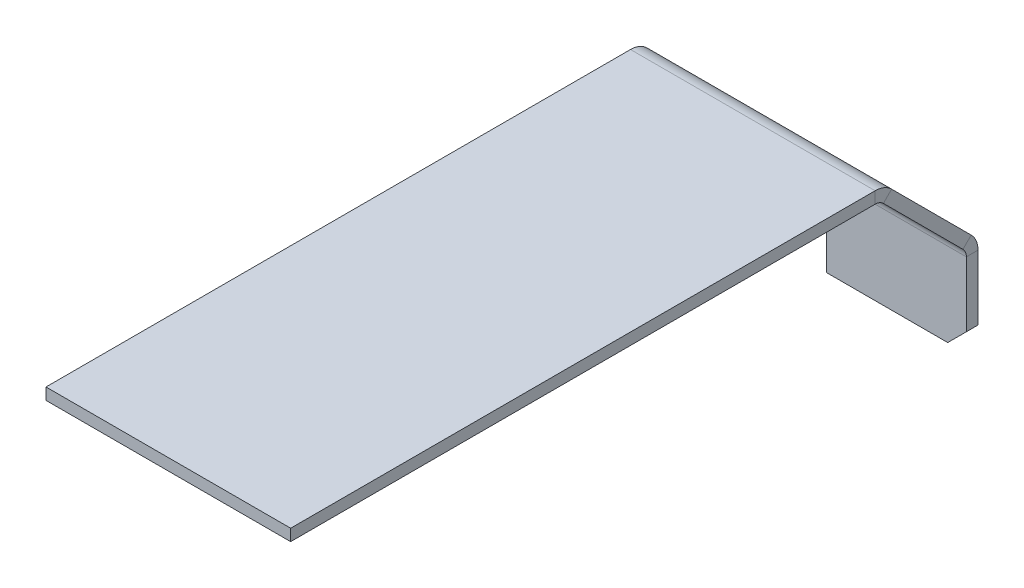
ISO-10303-21;
HEADER;
FILE_DESCRIPTION(('STEP AP214'),'2;1');
FILE_NAME('part.step','',(''),(''),'','','');
FILE_SCHEMA(('AUTOMOTIVE_DESIGN { 1 0 10303 214 1 1 1 1 }'));
ENDSEC;
DATA;
#1=APPLICATION_CONTEXT('core data for automotive mechanical design processes');
#2=APPLICATION_PROTOCOL_DEFINITION('international standard','automotive_design',2000,#1);
#3=PRODUCT_CONTEXT('',#1,'mechanical');
#4=PRODUCT('Part','Part','',(#3));
#5=PRODUCT_RELATED_PRODUCT_CATEGORY('part','',(#4));
#6=PRODUCT_DEFINITION_FORMATION('','',#4);
#7=PRODUCT_DEFINITION_CONTEXT('part definition',#1,'design');
#8=PRODUCT_DEFINITION('design','',#6,#7);
#9=PRODUCT_DEFINITION_SHAPE('','',#8);
#10=(LENGTH_UNIT() NAMED_UNIT(*) SI_UNIT(.MILLI.,.METRE.));
#11=(NAMED_UNIT(*) PLANE_ANGLE_UNIT() SI_UNIT($,.RADIAN.));
#12=(NAMED_UNIT(*) SI_UNIT($,.STERADIAN.) SOLID_ANGLE_UNIT());
#13=UNCERTAINTY_MEASURE_WITH_UNIT(LENGTH_MEASURE(1.E-05),#10,'distance_accuracy_value','');
#14=(GEOMETRIC_REPRESENTATION_CONTEXT(3) GLOBAL_UNCERTAINTY_ASSIGNED_CONTEXT((#13)) GLOBAL_UNIT_ASSIGNED_CONTEXT((#10,
#11,#12)) REPRESENTATION_CONTEXT('',''));
#15=CARTESIAN_POINT('',(0.,0.,0.));
#16=DIRECTION('',(0.,0.,1.));
#17=DIRECTION('',(1.,0.,0.));
#18=AXIS2_PLACEMENT_3D('',#15,#16,#17);
#19=CARTESIAN_POINT('',(52.5,-40.,-35.0000000000001));
#20=DIRECTION('',(0.,0.,-1.));
#21=DIRECTION('',(0.,1.,0.));
#22=AXIS2_PLACEMENT_3D('',#19,#20,#21);
#23=PLANE('',#22);
#24=DIRECTION('',(-1.,0.,0.));
#25=VECTOR('',#24,1.);
#26=CARTESIAN_POINT('',(52.5,-80.,-35.0000000000001));
#27=LINE('',#26,#25);
#28=CARTESIAN_POINT('',(44.5,-80.,-35.0000000000001));
#29=VERTEX_POINT('',#28);
#30=CARTESIAN_POINT('',(-7.50000000000006,-80.,-35.0000000000001));
#31=VERTEX_POINT('',#30);
#32=EDGE_CURVE('E259',#29,#31,#27,.T.);
#33=ORIENTED_EDGE('',*,*,#32,.F.);
#34=DIRECTION('',(-0.707106781186546,-0.707106781186549,0.));
#35=VECTOR('',#34,1.);
#36=CARTESIAN_POINT('',(44.5,-80.,-35.0000000000001));
#37=LINE('',#36,#35);
#38=CARTESIAN_POINT('',(52.5,-72.,-35.0000000000001));
#39=VERTEX_POINT('',#38);
#40=EDGE_CURVE('E60',#29,#39,#37,.F.);
#41=ORIENTED_EDGE('',*,*,#40,.T.);
#42=DIRECTION('',(0.,-1.,0.));
#43=VECTOR('',#42,1.);
#44=CARTESIAN_POINT('',(52.5,-40.,-35.0000000000001));
#45=LINE('',#44,#43);
#46=CARTESIAN_POINT('',(52.5,-44.142135623731,-35.0000000000001));
#47=VERTEX_POINT('',#46);
#48=EDGE_CURVE('E196',#47,#39,#45,.T.);
#49=ORIENTED_EDGE('',*,*,#48,.F.);
#50=DIRECTION('',(-1.,0.,0.));
#51=VECTOR('',#50,1.);
#52=CARTESIAN_POINT('',(52.5,-44.142135623731,-35.0000000000001));
#53=LINE('',#52,#51);
#54=CARTESIAN_POINT('',(-7.49999999999995,-44.1421356237309,-35.0000000000001));
#55=VERTEX_POINT('',#54);
#56=EDGE_CURVE('E182',#47,#55,#53,.T.);
#57=ORIENTED_EDGE('',*,*,#56,.T.);
#58=DIRECTION('',(0.,-1.,0.));
#59=VECTOR('',#58,1.);
#60=CARTESIAN_POINT('',(-7.49999999999995,-40.,-35.0000000000001));
#61=LINE('',#60,#59);
#62=EDGE_CURVE('E175',#55,#31,#61,.T.);
#63=ORIENTED_EDGE('',*,*,#62,.T.);
#64=EDGE_LOOP('',(#33,#41,#49,#57,#63));
#65=FACE_BOUND('',#64,.T.);
#66=ADVANCED_FACE('F38',(#65),#23,.F.);
#67=CARTESIAN_POINT('',(52.5,-80.,-40.));
#68=DIRECTION('',(0.,-1.,0.));
#69=DIRECTION('',(0.,0.,-1.));
#70=AXIS2_PLACEMENT_3D('',#67,#68,#69);
#71=PLANE('',#70);
#72=DIRECTION('',(-1.,0.,0.));
#73=VECTOR('',#72,1.);
#74=CARTESIAN_POINT('',(52.5,-80.,-40.));
#75=LINE('',#74,#73);
#76=CARTESIAN_POINT('',(44.5,-80.,-40.));
#77=VERTEX_POINT('',#76);
#78=CARTESIAN_POINT('',(-7.50000000000006,-80.,-40.));
#79=VERTEX_POINT('',#78);
#80=EDGE_CURVE('E257',#77,#79,#75,.T.);
#81=ORIENTED_EDGE('',*,*,#80,.F.);
#82=DIRECTION('',(0.,0.,1.));
#83=VECTOR('',#82,1.);
#84=CARTESIAN_POINT('',(44.5,-80.,-40.));
#85=LINE('',#84,#83);
#86=EDGE_CURVE('E382',#77,#29,#85,.T.);
#87=ORIENTED_EDGE('',*,*,#86,.T.);
#88=ORIENTED_EDGE('',*,*,#32,.T.);
#89=DIRECTION('',(0.,0.,1.));
#90=VECTOR('',#89,1.);
#91=CARTESIAN_POINT('',(-7.50000000000006,-80.,-35.0000000000001));
#92=LINE('',#91,#90);
#93=EDGE_CURVE('E187',#31,#79,#92,.F.);
#94=ORIENTED_EDGE('',*,*,#93,.T.);
#95=EDGE_LOOP('',(#81,#87,#88,#94));
#96=FACE_BOUND('',#95,.T.);
#97=ADVANCED_FACE('F328',(#96),#71,.T.);
#98=CARTESIAN_POINT('',(52.5,-40.,-40.));
#99=DIRECTION('',(0.,0.,-1.));
#100=DIRECTION('',(0.,1.,0.));
#101=AXIS2_PLACEMENT_3D('',#98,#99,#100);
#102=PLANE('',#101);
#103=DIRECTION('',(0.,-1.,0.));
#104=VECTOR('',#103,1.);
#105=CARTESIAN_POINT('',(52.5,-40.,-40.));
#106=LINE('',#105,#104);
#107=CARTESIAN_POINT('',(52.5,-44.1421356237309,-40.));
#108=VERTEX_POINT('',#107);
#109=CARTESIAN_POINT('',(52.5,-71.9999999999999,-40.));
#110=VERTEX_POINT('',#109);
#111=EDGE_CURVE('E198',#108,#110,#106,.T.);
#112=ORIENTED_EDGE('',*,*,#111,.T.);
#113=DIRECTION('',(0.707106781186546,0.707106781186549,0.));
#114=VECTOR('',#113,1.);
#115=CARTESIAN_POINT('',(68.5,-55.9999999999999,-40.));
#116=LINE('',#115,#114);
#117=EDGE_CURVE('E11',#110,#77,#116,.F.);
#118=ORIENTED_EDGE('',*,*,#117,.T.);
#119=ORIENTED_EDGE('',*,*,#80,.T.);
#120=DIRECTION('',(0.,1.,0.));
#121=VECTOR('',#120,1.);
#122=CARTESIAN_POINT('',(-7.49999999999995,-40.,-40.));
#123=LINE('',#122,#121);
#124=CARTESIAN_POINT('',(-7.49999999999995,-44.1421356237309,-40.));
#125=VERTEX_POINT('',#124);
#126=EDGE_CURVE('E392',#125,#79,#123,.F.);
#127=ORIENTED_EDGE('',*,*,#126,.F.);
#128=DIRECTION('',(-1.,0.,0.));
#129=VECTOR('',#128,1.);
#130=CARTESIAN_POINT('',(52.5,-44.1421356237309,-40.));
#131=LINE('',#130,#129);
#132=EDGE_CURVE('E254',#108,#125,#131,.T.);
#133=ORIENTED_EDGE('',*,*,#132,.F.);
#134=EDGE_LOOP('',(#112,#118,#119,#127,#133));
#135=FACE_BOUND('',#134,.T.);
#136=ADVANCED_FACE('F333',(#135),#102,.T.);
#137=CARTESIAN_POINT('',(52.5,-44.142135623731,-30.0000000000002));
#138=DIRECTION('',(-1.,0.,0.));
#139=DIRECTION('',(0.,0.,1.));
#140=AXIS2_PLACEMENT_3D('',#137,#138,#139);
#141=CYLINDRICAL_SURFACE('',#140,10.);
#142=ORIENTED_EDGE('',*,*,#132,.T.);
#143=CARTESIAN_POINT('',(-7.49999999999995,-44.142135623731,-30.0000000000002));
#144=DIRECTION('',(1.,0.,0.));
#145=DIRECTION('',(0.,1.,0.));
#146=AXIS2_PLACEMENT_3D('',#143,#144,#145);
#147=CIRCLE('',#146,10.);
#148=CARTESIAN_POINT('',(-7.49999999999995,-37.0710678118655,-37.0710678118655));
#149=VERTEX_POINT('',#148);
#150=EDGE_CURVE('E176',#149,#125,#147,.F.);
#151=ORIENTED_EDGE('',*,*,#150,.F.);
#152=DIRECTION('',(-1.,0.,0.));
#153=VECTOR('',#152,1.);
#154=CARTESIAN_POINT('',(52.5,-37.0710678118655,-37.0710678118655));
#155=LINE('',#154,#153);
#156=CARTESIAN_POINT('',(52.5,-37.0710678118655,-37.0710678118655));
#157=VERTEX_POINT('',#156);
#158=EDGE_CURVE('E251',#157,#149,#155,.T.);
#159=ORIENTED_EDGE('',*,*,#158,.F.);
#160=CARTESIAN_POINT('',(52.5,-44.142135623731,-30.0000000000002));
#161=DIRECTION('',(1.,0.,0.));
#162=DIRECTION('',(0.,0.,-1.));
#163=AXIS2_PLACEMENT_3D('',#160,#161,#162);
#164=CIRCLE('',#163,10.);
#165=EDGE_CURVE('E201',#157,#108,#164,.F.);
#166=ORIENTED_EDGE('',*,*,#165,.T.);
#167=EDGE_LOOP('',(#142,#151,#159,#166));
#168=FACE_BOUND('',#167,.T.);
#169=ADVANCED_FACE('F402',(#168),#141,.T.);
#170=CARTESIAN_POINT('',(52.5,0.,0.));
#171=DIRECTION('',(0.,0.707106781186548,-0.707106781186547));
#172=DIRECTION('',(0.,0.707106781186547,0.707106781186548));
#173=AXIS2_PLACEMENT_3D('',#170,#171,#172);
#174=PLANE('',#173);
#175=CARTESIAN_POINT('',(-65.4531328127443,-48.0582056827674,-48.0582056827679));
#176=DIRECTION('',(0.,0.707106781186548,-0.707106781186547));
#177=DIRECTION('',(0.,0.707106781186547,0.707106781186548));
#178=AXIS2_PLACEMENT_3D('',#175,#176,#177);
#179=CIRCLE('',#178,60.);
#180=CARTESIAN_POINT('',(-45.7790189732492,-7.97747936305993,-7.97747936305981));
#181=VERTEX_POINT('',#180);
#182=EDGE_CURVE('E160',#149,#181,#179,.F.);
#183=ORIENTED_EDGE('',*,*,#182,.T.);
#184=CARTESIAN_POINT('',(-42.5,-1.29735830977535,-1.29735830977573));
#185=DIRECTION('',(0.,0.707106781186548,-0.707106781186547));
#186=DIRECTION('',(0.,0.707106781186547,0.707106781186548));
#187=AXIS2_PLACEMENT_3D('',#184,#185,#186);
#188=CIRCLE('',#187,10.);
#189=CARTESIAN_POINT('',(-52.2301558753656,-2.92893218813452,-2.9289321881345));
#190=VERTEX_POINT('',#189);
#191=EDGE_CURVE('E273',#181,#190,#188,.T.);
#192=ORIENTED_EDGE('',*,*,#191,.T.);
#193=DIRECTION('',(-1.,0.,0.));
#194=VECTOR('',#193,1.);
#195=CARTESIAN_POINT('',(52.5,-2.92893218813452,-2.9289321881345));
#196=LINE('',#195,#194);
#197=CARTESIAN_POINT('',(52.5,-2.92893218813452,-2.9289321881345));
#198=VERTEX_POINT('',#197);
#199=EDGE_CURVE('E248',#198,#190,#196,.T.);
#200=ORIENTED_EDGE('',*,*,#199,.F.);
#201=DIRECTION('',(0.,-0.707106781186547,-0.707106781186548));
#202=VECTOR('',#201,1.);
#203=CARTESIAN_POINT('',(52.5,0.,0.));
#204=LINE('',#203,#202);
#205=EDGE_CURVE('E204',#198,#157,#204,.T.);
#206=ORIENTED_EDGE('',*,*,#205,.T.);
#207=ORIENTED_EDGE('',*,*,#158,.T.);
#208=EDGE_LOOP('',(#183,#192,#200,#206,#207));
#209=FACE_BOUND('',#208,.T.);
#210=ADVANCED_FACE('F367',(#209),#174,.T.);
#211=CARTESIAN_POINT('',(52.5,-3.53553390593274,3.53553390593309));
#212=DIRECTION('',(0.,0.707106781186548,-0.707106781186547));
#213=DIRECTION('',(0.,0.707106781186547,0.707106781186548));
#214=AXIS2_PLACEMENT_3D('',#211,#212,#213);
#215=PLANE('',#214);
#216=DIRECTION('',(-1.,0.,0.));
#217=VECTOR('',#216,1.);
#218=CARTESIAN_POINT('',(52.5,-6.46446609406726,0.606601717798583));
#219=LINE('',#218,#217);
#220=CARTESIAN_POINT('',(52.5,-6.46446609406726,0.606601717798583));
#221=VERTEX_POINT('',#220);
#222=CARTESIAN_POINT('',(-52.2301558753656,-6.46446609406726,0.606601717798583));
#223=VERTEX_POINT('',#222);
#224=EDGE_CURVE('E181',#221,#223,#219,.T.);
#225=ORIENTED_EDGE('',*,*,#224,.T.);
#226=CARTESIAN_POINT('',(-42.5,-4.83289221570809,2.23817559615735));
#227=DIRECTION('',(0.,0.707106781186548,-0.707106781186547));
#228=DIRECTION('',(0.,0.707106781186547,0.707106781186548));
#229=AXIS2_PLACEMENT_3D('',#226,#227,#228);
#230=CIRCLE('',#229,10.);
#231=CARTESIAN_POINT('',(-45.7790189732492,-11.5130132689927,-4.44194545712762));
#232=VERTEX_POINT('',#231);
#233=EDGE_CURVE('E154',#223,#232,#230,.F.);
#234=ORIENTED_EDGE('',*,*,#233,.T.);
#235=CARTESIAN_POINT('',(-65.4531328127443,-51.5937395887002,-44.5226717768348));
#236=DIRECTION('',(0.,0.707106781186548,-0.707106781186547));
#237=DIRECTION('',(0.,0.707106781186547,0.707106781186548));
#238=AXIS2_PLACEMENT_3D('',#235,#236,#237);
#239=CIRCLE('',#238,60.);
#240=CARTESIAN_POINT('',(-7.50000000000006,-40.6066017177982,-33.5355339059324));
#241=VERTEX_POINT('',#240);
#242=EDGE_CURVE('E145',#232,#241,#239,.T.);
#243=ORIENTED_EDGE('',*,*,#242,.T.);
#244=DIRECTION('',(-1.,0.,0.));
#245=VECTOR('',#244,1.);
#246=CARTESIAN_POINT('',(52.5,-40.6066017177982,-33.5355339059324));
#247=LINE('',#246,#245);
#248=CARTESIAN_POINT('',(52.5,-40.6066017177982,-33.5355339059324));
#249=VERTEX_POINT('',#248);
#250=EDGE_CURVE('E151',#249,#241,#247,.T.);
#251=ORIENTED_EDGE('',*,*,#250,.F.);
#252=DIRECTION('',(0.,-0.707106781186547,-0.707106781186548));
#253=VECTOR('',#252,1.);
#254=CARTESIAN_POINT('',(52.5,-3.53553390593274,3.53553390593309));
#255=LINE('',#254,#253);
#256=EDGE_CURVE('E222',#221,#249,#255,.T.);
#257=ORIENTED_EDGE('',*,*,#256,.F.);
#258=EDGE_LOOP('',(#225,#234,#243,#251,#257));
#259=FACE_BOUND('',#258,.T.);
#260=ADVANCED_FACE('F148',(#259),#215,.F.);
#261=CARTESIAN_POINT('',(52.5,-44.142135623731,-30.0000000000002));
#262=DIRECTION('',(-1.,0.,0.));
#263=DIRECTION('',(0.,0.,1.));
#264=AXIS2_PLACEMENT_3D('',#261,#262,#263);
#265=CYLINDRICAL_SURFACE('',#264,5.);
#266=CARTESIAN_POINT('',(-7.50000000000006,-44.142135623731,-30.0000000000002));
#267=DIRECTION('',(-1.,0.,0.));
#268=DIRECTION('',(0.,0.,1.));
#269=AXIS2_PLACEMENT_3D('',#266,#267,#268);
#270=CIRCLE('',#269,5.);
#271=EDGE_CURVE('E165',#241,#55,#270,.T.);
#272=ORIENTED_EDGE('',*,*,#271,.T.);
#273=ORIENTED_EDGE('',*,*,#56,.F.);
#274=CARTESIAN_POINT('',(52.5,-44.142135623731,-30.0000000000002));
#275=DIRECTION('',(1.,0.,0.));
#276=DIRECTION('',(0.,0.,-1.));
#277=AXIS2_PLACEMENT_3D('',#274,#275,#276);
#278=CIRCLE('',#277,5.);
#279=EDGE_CURVE('E180',#249,#47,#278,.F.);
#280=ORIENTED_EDGE('',*,*,#279,.F.);
#281=ORIENTED_EDGE('',*,*,#250,.T.);
#282=EDGE_LOOP('',(#272,#273,#280,#281));
#283=FACE_BOUND('',#282,.T.);
#284=ADVANCED_FACE('F178',(#283),#265,.F.);
#285=CARTESIAN_POINT('',(52.5,-2.92893218813452,-2.9289321881345));
#286=DIRECTION('',(1.,0.,0.));
#287=DIRECTION('',(0.,0.,-1.));
#288=AXIS2_PLACEMENT_3D('',#285,#286,#287);
#289=PLANE('',#288);
#290=DIRECTION('',(0.,-0.707106781186548,0.707106781186547));
#291=VECTOR('',#290,1.);
#292=CARTESIAN_POINT('',(52.5,-2.92893218813452,-2.9289321881345));
#293=LINE('',#292,#291);
#294=EDGE_CURVE('E269',#198,#221,#293,.T.);
#295=ORIENTED_EDGE('',*,*,#294,.F.);
#296=CARTESIAN_POINT('',(52.5,-10.,4.14213562373078));
#297=DIRECTION('',(1.,0.,0.));
#298=DIRECTION('',(0.,0.,-1.));
#299=AXIS2_PLACEMENT_3D('',#296,#297,#298);
#300=CIRCLE('',#299,10.);
#301=CARTESIAN_POINT('',(52.5,0.,4.14213562373078));
#302=VERTEX_POINT('',#301);
#303=EDGE_CURVE('E207',#302,#198,#300,.F.);
#304=ORIENTED_EDGE('',*,*,#303,.F.);
#305=DIRECTION('',(0.,1.,0.));
#306=VECTOR('',#305,1.);
#307=CARTESIAN_POINT('',(52.5,-5.,4.14213562373078));
#308=LINE('',#307,#306);
#309=CARTESIAN_POINT('',(52.5,-5.,4.14213562373078));
#310=VERTEX_POINT('',#309);
#311=EDGE_CURVE('E267',#310,#302,#308,.T.);
#312=ORIENTED_EDGE('',*,*,#311,.F.);
#313=CARTESIAN_POINT('',(52.5,-10.,4.14213562373078));
#314=DIRECTION('',(1.,0.,0.));
#315=DIRECTION('',(0.,0.,-1.));
#316=AXIS2_PLACEMENT_3D('',#313,#314,#315);
#317=CIRCLE('',#316,5.);
#318=EDGE_CURVE('E219',#310,#221,#317,.F.);
#319=ORIENTED_EDGE('',*,*,#318,.T.);
#320=EDGE_LOOP('',(#295,#304,#312,#319));
#321=FACE_BOUND('',#320,.T.);
#322=ADVANCED_FACE('F354',(#321),#289,.T.);
#323=CARTESIAN_POINT('',(52.5,-5.,4.14213562373078));
#324=DIRECTION('',(1.,0.,0.));
#325=DIRECTION('',(0.,0.,-1.));
#326=AXIS2_PLACEMENT_3D('',#323,#324,#325);
#327=PLANE('',#326);
#328=ORIENTED_EDGE('',*,*,#205,.F.);
#329=ORIENTED_EDGE('',*,*,#294,.T.);
#330=ORIENTED_EDGE('',*,*,#256,.T.);
#331=DIRECTION('',(0.,0.707106781186547,-0.707106781186548));
#332=VECTOR('',#331,1.);
#333=CARTESIAN_POINT('',(52.5,-40.6066017177982,-33.5355339059324));
#334=LINE('',#333,#332);
#335=EDGE_CURVE('E261',#249,#157,#334,.T.);
#336=ORIENTED_EDGE('',*,*,#335,.T.);
#337=EDGE_LOOP('',(#328,#329,#330,#336));
#338=FACE_BOUND('',#337,.T.);
#339=ADVANCED_FACE('F351',(#338),#327,.T.);
#340=CARTESIAN_POINT('',(-52.5,0.,4.14213562373078));
#341=DIRECTION('',(-1.,0.,0.));
#342=DIRECTION('',(0.,0.,1.));
#343=AXIS2_PLACEMENT_3D('',#340,#341,#342);
#344=PLANE('',#343);
#345=CARTESIAN_POINT('',(-52.5,-10.,4.14213562373078));
#346=DIRECTION('',(1.,0.,0.));
#347=DIRECTION('',(0.,0.,-1.));
#348=AXIS2_PLACEMENT_3D('',#345,#346,#347);
#349=CIRCLE('',#348,10.);
#350=CARTESIAN_POINT('',(-52.5,0.,4.14213562373078));
#351=VERTEX_POINT('',#350);
#352=CARTESIAN_POINT('',(-52.5,-1.48816692016767,-1.10654969938295));
#353=VERTEX_POINT('',#352);
#354=EDGE_CURVE('E186',#351,#353,#349,.F.);
#355=ORIENTED_EDGE('',*,*,#354,.T.);
#356=DIRECTION('',(0.,-0.707106781186548,0.707106781186547));
#357=VECTOR('',#356,1.);
#358=CARTESIAN_POINT('',(-52.5,-4.83289221570809,2.23817559615735));
#359=LINE('',#358,#357);
#360=CARTESIAN_POINT('',(-52.5,-5.23187280957103,2.63715619002003));
#361=VERTEX_POINT('',#360);
#362=EDGE_CURVE('E282',#353,#361,#359,.T.);
#363=ORIENTED_EDGE('',*,*,#362,.T.);
#364=CARTESIAN_POINT('',(-52.5,-10.,4.14213562373078));
#365=DIRECTION('',(1.,0.,0.));
#366=DIRECTION('',(0.,0.,-1.));
#367=AXIS2_PLACEMENT_3D('',#364,#365,#366);
#368=CIRCLE('',#367,5.);
#369=CARTESIAN_POINT('',(-52.5,-5.,4.14213562373078));
#370=VERTEX_POINT('',#369);
#371=EDGE_CURVE('E199',#370,#361,#368,.F.);
#372=ORIENTED_EDGE('',*,*,#371,.F.);
#373=DIRECTION('',(0.,-1.,0.));
#374=VECTOR('',#373,1.);
#375=CARTESIAN_POINT('',(-52.5,0.,4.14213562373078));
#376=LINE('',#375,#374);
#377=EDGE_CURVE('E265',#351,#370,#376,.T.);
#378=ORIENTED_EDGE('',*,*,#377,.F.);
#379=EDGE_LOOP('',(#355,#363,#372,#378));
#380=FACE_BOUND('',#379,.T.);
#381=ADVANCED_FACE('F347',(#380),#344,.T.);
#382=CARTESIAN_POINT('',(-52.5,-6.46446609406726,0.606601717798583));
#383=DIRECTION('',(-1.,0.,0.));
#384=DIRECTION('',(0.,0.,1.));
#385=AXIS2_PLACEMENT_3D('',#382,#383,#384);
#386=PLANE('',#385);
#387=DIRECTION('',(0.,0.,-1.));
#388=VECTOR('',#387,1.);
#389=CARTESIAN_POINT('',(-52.5,0.,0.));
#390=LINE('',#389,#388);
#391=CARTESIAN_POINT('',(-52.5,0.,255.));
#392=VERTEX_POINT('',#391);
#393=EDGE_CURVE('E190',#392,#351,#390,.T.);
#394=ORIENTED_EDGE('',*,*,#393,.T.);
#395=ORIENTED_EDGE('',*,*,#377,.T.);
#396=DIRECTION('',(0.,0.,-1.));
#397=VECTOR('',#396,1.);
#398=CARTESIAN_POINT('',(-52.5,-5.,0.));
#399=LINE('',#398,#397);
#400=CARTESIAN_POINT('',(-52.5,-5.00000000000003,255.));
#401=VERTEX_POINT('',#400);
#402=EDGE_CURVE('E231',#401,#370,#399,.T.);
#403=ORIENTED_EDGE('',*,*,#402,.F.);
#404=DIRECTION('',(0.,1.,0.));
#405=VECTOR('',#404,1.);
#406=CARTESIAN_POINT('',(-52.5,-5.00000000000003,255.));
#407=LINE('',#406,#405);
#408=EDGE_CURVE('E228',#401,#392,#407,.T.);
#409=ORIENTED_EDGE('',*,*,#408,.T.);
#410=EDGE_LOOP('',(#394,#395,#403,#409));
#411=FACE_BOUND('',#410,.T.);
#412=ADVANCED_FACE('F343',(#411),#386,.T.);
#413=CARTESIAN_POINT('',(52.5,-44.1421356237309,-40.));
#414=DIRECTION('',(1.,0.,0.));
#415=DIRECTION('',(0.,0.,-1.));
#416=AXIS2_PLACEMENT_3D('',#413,#414,#415);
#417=PLANE('',#416);
#418=DIRECTION('',(0.,0.,1.));
#419=VECTOR('',#418,1.);
#420=CARTESIAN_POINT('',(52.5,-44.1421356237309,-40.));
#421=LINE('',#420,#419);
#422=EDGE_CURVE('E263',#108,#47,#421,.T.);
#423=ORIENTED_EDGE('',*,*,#422,.F.);
#424=ORIENTED_EDGE('',*,*,#165,.F.);
#425=ORIENTED_EDGE('',*,*,#335,.F.);
#426=ORIENTED_EDGE('',*,*,#279,.T.);
#427=EDGE_LOOP('',(#423,#424,#425,#426));
#428=FACE_BOUND('',#427,.T.);
#429=ADVANCED_FACE('F340',(#428),#417,.T.);
#430=CARTESIAN_POINT('',(52.5,-40.6066017177982,-33.5355339059324));
#431=DIRECTION('',(1.,0.,0.));
#432=DIRECTION('',(0.,0.,-1.));
#433=AXIS2_PLACEMENT_3D('',#430,#431,#432);
#434=PLANE('',#433);
#435=ORIENTED_EDGE('',*,*,#48,.T.);
#436=DIRECTION('',(0.,0.,-1.));
#437=VECTOR('',#436,1.);
#438=CARTESIAN_POINT('',(52.5,-71.9999999999999,-33.5355339059324));
#439=LINE('',#438,#437);
#440=EDGE_CURVE('E46',#39,#110,#439,.T.);
#441=ORIENTED_EDGE('',*,*,#440,.T.);
#442=ORIENTED_EDGE('',*,*,#111,.F.);
#443=ORIENTED_EDGE('',*,*,#422,.T.);
#444=EDGE_LOOP('',(#435,#441,#442,#443));
#445=FACE_BOUND('',#444,.T.);
#446=ADVANCED_FACE('F324',(#445),#434,.T.);
#447=CARTESIAN_POINT('',(52.5,-10.,4.14213562373078));
#448=DIRECTION('',(-1.,0.,0.));
#449=DIRECTION('',(0.,0.,1.));
#450=AXIS2_PLACEMENT_3D('',#447,#448,#449);
#451=CYLINDRICAL_SURFACE('',#450,10.);
#452=ORIENTED_EDGE('',*,*,#199,.T.);
#453=CARTESIAN_POINT('',(-52.2301558753656,-2.92893218813452,-2.9289321881345));
#454=CARTESIAN_POINT('',(-52.2755120491524,-2.79376643781071,-2.79381225711554));
#455=CARTESIAN_POINT('',(-52.3151749231606,-2.66155803735943,-2.65380915356384));
#456=CARTESIAN_POINT('',(-52.3828126562943,-2.40504393800453,-2.36581479134416));
#457=CARTESIAN_POINT('',(-52.4108641931491,-2.28069114424874,-2.2178834693805));
#458=CARTESIAN_POINT('',(-52.45558826719,-2.04003172456594,-1.91397465762442));
#459=CARTESIAN_POINT('',(-52.4722608043762,-1.92372509863893,-1.75799716783199));
#460=CARTESIAN_POINT('',(-52.4945207117214,-1.69929796761458,-1.43791583728176));
#461=CARTESIAN_POINT('',(-52.5000323991411,-1.59123810278567,-1.27376419810771));
#462=CARTESIAN_POINT('',(-52.5,-1.48816692016767,-1.10654969938295));
#463=B_SPLINE_CURVE_WITH_KNOTS('',3,(#453,#454,#455,#456,#457,#458,#459,#460,#461,#462),
.UNSPECIFIED.,.F.,.F.,(4,2,2,2,4),(0.,0.589138423998454,1.17432177861841,1.75950513323835,
2.3486435572368),.UNSPECIFIED.);
#464=EDGE_CURVE('E275',#190,#353,#463,.T.);
#465=ORIENTED_EDGE('',*,*,#464,.T.);
#466=ORIENTED_EDGE('',*,*,#354,.F.);
#467=DIRECTION('',(-1.,0.,0.));
#468=VECTOR('',#467,1.);
#469=CARTESIAN_POINT('',(52.5,0.,4.14213562373078));
#470=LINE('',#469,#468);
#471=EDGE_CURVE('E245',#302,#351,#470,.T.);
#472=ORIENTED_EDGE('',*,*,#471,.F.);
#473=ORIENTED_EDGE('',*,*,#303,.T.);
#474=EDGE_LOOP('',(#452,#465,#466,#472,#473));
#475=FACE_BOUND('',#474,.T.);
#476=ADVANCED_FACE('F284',(#475),#451,.T.);
#477=CARTESIAN_POINT('',(52.5,0.,0.));
#478=DIRECTION('',(0.,1.,0.));
#479=DIRECTION('',(0.,0.,1.));
#480=AXIS2_PLACEMENT_3D('',#477,#478,#479);
#481=PLANE('',#480);
#482=ORIENTED_EDGE('',*,*,#393,.F.);
#483=DIRECTION('',(-1.,0.,0.));
#484=VECTOR('',#483,1.);
#485=CARTESIAN_POINT('',(52.5,0.,255.));
#486=LINE('',#485,#484);
#487=CARTESIAN_POINT('',(52.5,0.,255.));
#488=VERTEX_POINT('',#487);
#489=EDGE_CURVE('E243',#488,#392,#486,.T.);
#490=ORIENTED_EDGE('',*,*,#489,.F.);
#491=DIRECTION('',(0.,0.,-1.));
#492=VECTOR('',#491,1.);
#493=CARTESIAN_POINT('',(52.5,0.,0.));
#494=LINE('',#493,#492);
#495=EDGE_CURVE('E210',#488,#302,#494,.T.);
#496=ORIENTED_EDGE('',*,*,#495,.T.);
#497=ORIENTED_EDGE('',*,*,#471,.T.);
#498=EDGE_LOOP('',(#482,#490,#496,#497));
#499=FACE_BOUND('',#498,.T.);
#500=ADVANCED_FACE('F317',(#499),#481,.T.);
#501=CARTESIAN_POINT('',(52.5,-5.00000000000004,255.));
#502=DIRECTION('',(0.,0.,1.));
#503=DIRECTION('',(1.,0.,0.));
#504=AXIS2_PLACEMENT_3D('',#501,#502,#503);
#505=PLANE('',#504);
#506=ORIENTED_EDGE('',*,*,#408,.F.);
#507=DIRECTION('',(-1.,0.,0.));
#508=VECTOR('',#507,1.);
#509=CARTESIAN_POINT('',(52.5,-5.00000000000004,255.));
#510=LINE('',#509,#508);
#511=CARTESIAN_POINT('',(52.5,-5.00000000000004,255.));
#512=VERTEX_POINT('',#511);
#513=EDGE_CURVE('E241',#512,#401,#510,.T.);
#514=ORIENTED_EDGE('',*,*,#513,.F.);
#515=DIRECTION('',(0.,1.,0.));
#516=VECTOR('',#515,1.);
#517=CARTESIAN_POINT('',(52.5,-5.00000000000004,255.));
#518=LINE('',#517,#516);
#519=EDGE_CURVE('E213',#512,#488,#518,.T.);
#520=ORIENTED_EDGE('',*,*,#519,.T.);
#521=ORIENTED_EDGE('',*,*,#489,.T.);
#522=EDGE_LOOP('',(#506,#514,#520,#521));
#523=FACE_BOUND('',#522,.T.);
#524=ADVANCED_FACE('F314',(#523),#505,.T.);
#525=CARTESIAN_POINT('',(52.5,-5.,0.));
#526=DIRECTION('',(0.,1.,0.));
#527=DIRECTION('',(0.,0.,1.));
#528=AXIS2_PLACEMENT_3D('',#525,#526,#527);
#529=PLANE('',#528);
#530=ORIENTED_EDGE('',*,*,#402,.T.);
#531=DIRECTION('',(-1.,0.,0.));
#532=VECTOR('',#531,1.);
#533=CARTESIAN_POINT('',(52.5,-5.,4.14213562373078));
#534=LINE('',#533,#532);
#535=EDGE_CURVE('E238',#310,#370,#534,.T.);
#536=ORIENTED_EDGE('',*,*,#535,.F.);
#537=DIRECTION('',(0.,0.,-1.));
#538=VECTOR('',#537,1.);
#539=CARTESIAN_POINT('',(52.5,-5.,0.));
#540=LINE('',#539,#538);
#541=EDGE_CURVE('E216',#512,#310,#540,.T.);
#542=ORIENTED_EDGE('',*,*,#541,.F.);
#543=ORIENTED_EDGE('',*,*,#513,.T.);
#544=EDGE_LOOP('',(#530,#536,#542,#543));
#545=FACE_BOUND('',#544,.T.);
#546=ADVANCED_FACE('F309',(#545),#529,.F.);
#547=CARTESIAN_POINT('',(52.5,-10.,4.14213562373078));
#548=DIRECTION('',(-1.,0.,0.));
#549=DIRECTION('',(0.,0.,1.));
#550=AXIS2_PLACEMENT_3D('',#547,#548,#549);
#551=CYLINDRICAL_SURFACE('',#550,5.);
#552=ORIENTED_EDGE('',*,*,#371,.T.);
#553=CARTESIAN_POINT('',(-52.5,-5.23187280957103,2.63715619002003));
#554=CARTESIAN_POINT('',(-52.5000172322947,-5.27093684810085,2.51332424898156));
#555=CARTESIAN_POINT('',(-52.4980105357305,-5.31486603216629,2.39101630509088));
#556=CARTESIAN_POINT('',(-52.4895805158301,-5.41205092191338,2.15027073370514));
#557=CARTESIAN_POINT('',(-52.4831555923372,-5.46531000140896,2.03183452472763));
#558=CARTESIAN_POINT('',(-52.4657136191005,-5.57945362895866,1.80229637175124));
#559=CARTESIAN_POINT('',(-52.4548006070726,-5.64014484118248,1.69109044009404));
#560=CARTESIAN_POINT('',(-52.4281923737998,-5.76947204601391,1.47406780066958));
#561=CARTESIAN_POINT('',(-52.4124992448378,-5.83810455453917,1.36824875863602));
#562=CARTESIAN_POINT('',(-52.3735850130603,-5.99318512037874,1.1477910056929));
#563=CARTESIAN_POINT('',(-52.3496038466965,-6.08077449576561,1.03408700103548));
#564=CARTESIAN_POINT('',(-52.2949315305974,-6.26571014612407,0.814058976538084));
#565=CARTESIAN_POINT('',(-52.2641581368478,-6.36316731033073,0.707848531725068));
#566=CARTESIAN_POINT('',(-52.2301558753656,-6.46446609406726,0.606601717798583));
#567=B_SPLINE_CURVE_WITH_KNOTS('',3,(#553,#554,#555,#556,#557,#558,#559,#560,#561,#562,#563,
#564,#565,#566),.UNSPECIFIED.,.F.,.F.,(4,2,2,2,2,2,4),(0.,0.389443849312867,0.779028818491141,
1.16005080840971,1.54090626202969,1.9767886839531,2.41827080433567),.UNSPECIFIED.);
#568=EDGE_CURVE('E295',#361,#223,#567,.T.);
#569=ORIENTED_EDGE('',*,*,#568,.T.);
#570=ORIENTED_EDGE('',*,*,#224,.F.);
#571=ORIENTED_EDGE('',*,*,#318,.F.);
#572=ORIENTED_EDGE('',*,*,#535,.T.);
#573=EDGE_LOOP('',(#552,#569,#570,#571,#572));
#574=FACE_BOUND('',#573,.T.);
#575=ADVANCED_FACE('F303',(#574),#551,.F.);
#576=CARTESIAN_POINT('',(52.5,-44.142135623731,-30.0000000000002));
#577=DIRECTION('',(1.,0.,0.));
#578=DIRECTION('',(0.,0.,-1.));
#579=AXIS2_PLACEMENT_3D('',#576,#577,#578);
#580=PLANE('',#579);
#581=ORIENTED_EDGE('',*,*,#541,.T.);
#582=ORIENTED_EDGE('',*,*,#311,.T.);
#583=ORIENTED_EDGE('',*,*,#495,.F.);
#584=ORIENTED_EDGE('',*,*,#519,.F.);
#585=EDGE_LOOP('',(#581,#582,#583,#584));
#586=FACE_BOUND('',#585,.T.);
#587=ADVANCED_FACE('F308',(#586),#580,.T.);
#588=CARTESIAN_POINT('',(-7.49999999999995,-40.,-35.0000000000001));
#589=DIRECTION('',(1.,0.,0.));
#590=DIRECTION('',(0.,-1.,0.));
#591=AXIS2_PLACEMENT_3D('',#588,#589,#590);
#592=PLANE('',#591);
#593=ORIENTED_EDGE('',*,*,#93,.F.);
#594=ORIENTED_EDGE('',*,*,#62,.F.);
#595=DIRECTION('',(0.,0.,1.));
#596=VECTOR('',#595,1.);
#597=CARTESIAN_POINT('',(-7.49999999999995,-44.1421356237309,-35.0000000000001));
#598=LINE('',#597,#596);
#599=EDGE_CURVE('E170',#55,#125,#598,.F.);
#600=ORIENTED_EDGE('',*,*,#599,.T.);
#601=ORIENTED_EDGE('',*,*,#126,.T.);
#602=EDGE_LOOP('',(#593,#594,#600,#601));
#603=FACE_BOUND('',#602,.T.);
#604=ADVANCED_FACE('F399',(#603),#592,.F.);
#605=CARTESIAN_POINT('',(-7.49999999999995,-44.142135623731,-30.0000000000002));
#606=DIRECTION('',(-1.,0.,0.));
#607=DIRECTION('',(0.,-1.,0.));
#608=AXIS2_PLACEMENT_3D('',#605,#606,#607);
#609=PLANE('',#608);
#610=ORIENTED_EDGE('',*,*,#150,.T.);
#611=ORIENTED_EDGE('',*,*,#599,.F.);
#612=ORIENTED_EDGE('',*,*,#271,.F.);
#613=DIRECTION('',(0.,0.707106781186548,-0.707106781186547));
#614=VECTOR('',#613,1.);
#615=CARTESIAN_POINT('',(-7.49999999999995,-37.0710678118655,-37.0710678118655));
#616=LINE('',#615,#614);
#617=EDGE_CURVE('E167',#149,#241,#616,.F.);
#618=ORIENTED_EDGE('',*,*,#617,.F.);
#619=EDGE_LOOP('',(#610,#611,#612,#618));
#620=FACE_BOUND('',#619,.T.);
#621=ADVANCED_FACE('F166',(#620),#609,.T.);
#622=CARTESIAN_POINT('',(-65.4531328127443,-48.0582056827674,-48.0582056827679));
#623=DIRECTION('',(0.,0.707106781186548,-0.707106781186547));
#624=DIRECTION('',(0.,0.707106781186547,0.707106781186548));
#625=AXIS2_PLACEMENT_3D('',#622,#623,#624);
#626=CYLINDRICAL_SURFACE('',#625,60.);
#627=ORIENTED_EDGE('',*,*,#242,.F.);
#628=DIRECTION('',(0.,0.707106781186548,-0.707106781186547));
#629=VECTOR('',#628,1.);
#630=CARTESIAN_POINT('',(-45.7790189732492,-7.97747936305993,-7.97747936305981));
#631=LINE('',#630,#629);
#632=EDGE_CURVE('E159',#232,#181,#631,.T.);
#633=ORIENTED_EDGE('',*,*,#632,.T.);
#634=ORIENTED_EDGE('',*,*,#182,.F.);
#635=ORIENTED_EDGE('',*,*,#617,.T.);
#636=EDGE_LOOP('',(#627,#633,#634,#635));
#637=FACE_BOUND('',#636,.T.);
#638=ADVANCED_FACE('F184',(#637),#626,.F.);
#639=CARTESIAN_POINT('',(-42.5,-1.29735830977536,-1.29735830977573));
#640=DIRECTION('',(0.,0.707106781186548,-0.707106781186547));
#641=DIRECTION('',(0.,0.707106781186547,0.707106781186548));
#642=AXIS2_PLACEMENT_3D('',#639,#640,#641);
#643=CYLINDRICAL_SURFACE('',#642,10.);
#644=ORIENTED_EDGE('',*,*,#568,.F.);
#645=ORIENTED_EDGE('',*,*,#362,.F.);
#646=ORIENTED_EDGE('',*,*,#464,.F.);
#647=ORIENTED_EDGE('',*,*,#191,.F.);
#648=ORIENTED_EDGE('',*,*,#632,.F.);
#649=ORIENTED_EDGE('',*,*,#233,.F.);
#650=EDGE_LOOP('',(#644,#645,#646,#647,#648,#649));
#651=FACE_BOUND('',#650,.T.);
#652=ADVANCED_FACE('F288',(#651),#643,.T.);
#653=CARTESIAN_POINT('',(44.5,-80.,-40.));
#654=DIRECTION('',(-0.707106781186549,0.707106781186546,0.));
#655=DIRECTION('',(0.,0.,1.));
#656=AXIS2_PLACEMENT_3D('',#653,#654,#655);
#657=PLANE('',#656);
#658=ORIENTED_EDGE('',*,*,#117,.F.);
#659=ORIENTED_EDGE('',*,*,#440,.F.);
#660=ORIENTED_EDGE('',*,*,#40,.F.);
#661=ORIENTED_EDGE('',*,*,#86,.F.);
#662=EDGE_LOOP('',(#658,#659,#660,#661));
#663=FACE_BOUND('',#662,.T.);
#664=ADVANCED_FACE('F40',(#663),#657,.F.);
#665=CLOSED_SHELL('',(#66,#97,#136,#169,#210,#260,#284,#322,#339,#381,#412,#429,#446,#476,#500,
#524,#546,#575,#587,#604,#621,#638,#652,#664));
#666=MANIFOLD_SOLID_BREP('B2',#665);
#667=ADVANCED_BREP_SHAPE_REPRESENTATION('',(#18,#666),#14);
#668=SHAPE_DEFINITION_REPRESENTATION(#9,#667);
ENDSEC;
END-ISO-10303-21;
